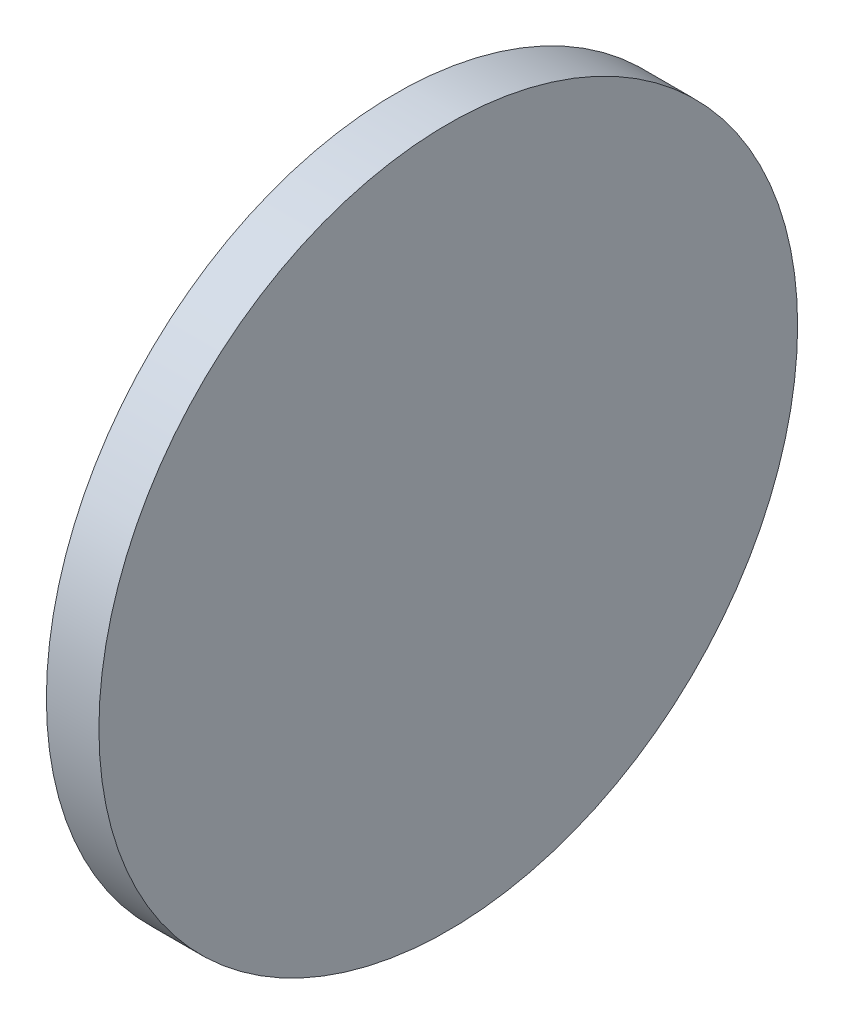
ISO-10303-21;
HEADER;
FILE_DESCRIPTION(('STEP AP214'),'2;1');
FILE_NAME('part.step','',(''),(''),'','','');
FILE_SCHEMA(('AUTOMOTIVE_DESIGN { 1 0 10303 214 1 1 1 1 }'));
ENDSEC;
DATA;
#1=APPLICATION_CONTEXT('core data for automotive mechanical design processes');
#2=APPLICATION_PROTOCOL_DEFINITION('international standard','automotive_design',2000,#1);
#3=PRODUCT_CONTEXT('',#1,'mechanical');
#4=PRODUCT('Part','Part','',(#3));
#5=PRODUCT_RELATED_PRODUCT_CATEGORY('part','',(#4));
#6=PRODUCT_DEFINITION_FORMATION('','',#4);
#7=PRODUCT_DEFINITION_CONTEXT('part definition',#1,'design');
#8=PRODUCT_DEFINITION('design','',#6,#7);
#9=PRODUCT_DEFINITION_SHAPE('','',#8);
#10=(LENGTH_UNIT() NAMED_UNIT(*) SI_UNIT(.MILLI.,.METRE.));
#11=(NAMED_UNIT(*) PLANE_ANGLE_UNIT() SI_UNIT($,.RADIAN.));
#12=(NAMED_UNIT(*) SI_UNIT($,.STERADIAN.) SOLID_ANGLE_UNIT());
#13=UNCERTAINTY_MEASURE_WITH_UNIT(LENGTH_MEASURE(1.E-05),#10,'distance_accuracy_value','');
#14=(GEOMETRIC_REPRESENTATION_CONTEXT(3) GLOBAL_UNCERTAINTY_ASSIGNED_CONTEXT((#13)) GLOBAL_UNIT_ASSIGNED_CONTEXT((#10,
#11,#12)) REPRESENTATION_CONTEXT('',''));
#15=CARTESIAN_POINT('',(0.,0.,0.));
#16=DIRECTION('',(0.,0.,1.));
#17=DIRECTION('',(1.,0.,0.));
#18=AXIS2_PLACEMENT_3D('',#15,#16,#17);
#19=CARTESIAN_POINT('',(1.5,-23.7880031249674,-50.8608241014675));
#20=DIRECTION('',(-1.,0.,0.));
#21=DIRECTION('',(0.,0.,1.));
#22=AXIS2_PLACEMENT_3D('',#19,#20,#21);
#23=CYLINDRICAL_SURFACE('',#22,9.975);
#24=CARTESIAN_POINT('',(1.5,-23.7880031249674,-50.8608241014675));
#25=DIRECTION('',(1.,0.,0.));
#26=DIRECTION('',(0.,0.,-1.));
#27=AXIS2_PLACEMENT_3D('',#24,#25,#26);
#28=CIRCLE('',#27,9.975);
#29=CARTESIAN_POINT('',(1.5,-23.7880031249674,-60.8358241014675));
#30=VERTEX_POINT('',#29);
#31=EDGE_CURVE('E10',#30,#30,#28,.T.);
#32=ORIENTED_EDGE('',*,*,#31,.F.);
#33=EDGE_LOOP('',(#32));
#34=FACE_BOUND('',#33,.T.);
#35=CARTESIAN_POINT('',(0.,-23.7880031249674,-50.8608241014675));
#36=DIRECTION('',(1.,0.,0.));
#37=DIRECTION('',(0.,0.,-1.));
#38=AXIS2_PLACEMENT_3D('',#35,#36,#37);
#39=CIRCLE('',#38,9.975);
#40=CARTESIAN_POINT('',(0.,-23.7880031249674,-60.8358241014675));
#41=VERTEX_POINT('',#40);
#42=EDGE_CURVE('E36',#41,#41,#39,.T.);
#43=ORIENTED_EDGE('',*,*,#42,.T.);
#44=EDGE_LOOP('',(#43));
#45=FACE_BOUND('',#44,.T.);
#46=ADVANCED_FACE('F33',(#34,#45),#23,.T.);
#47=CARTESIAN_POINT('',(1.5,-23.7880031249674,-50.8608241014675));
#48=DIRECTION('',(1.,0.,0.));
#49=DIRECTION('',(0.,0.,-1.));
#50=AXIS2_PLACEMENT_3D('',#47,#48,#49);
#51=PLANE('',#50);
#52=ORIENTED_EDGE('',*,*,#31,.T.);
#53=EDGE_LOOP('',(#52));
#54=FACE_BOUND('',#53,.T.);
#55=ADVANCED_FACE('F48',(#54),#51,.T.);
#56=CARTESIAN_POINT('',(0.,-23.7880031249674,-50.8608241014675));
#57=DIRECTION('',(1.,0.,0.));
#58=DIRECTION('',(0.,0.,-1.));
#59=AXIS2_PLACEMENT_3D('',#56,#57,#58);
#60=PLANE('',#59);
#61=ORIENTED_EDGE('',*,*,#42,.F.);
#62=EDGE_LOOP('',(#61));
#63=FACE_BOUND('',#62,.T.);
#64=ADVANCED_FACE('F46',(#63),#60,.F.);
#65=CLOSED_SHELL('',(#46,#55,#64));
#66=MANIFOLD_SOLID_BREP('B2',#65);
#67=ADVANCED_BREP_SHAPE_REPRESENTATION('',(#18,#66),#14);
#68=SHAPE_DEFINITION_REPRESENTATION(#9,#67);
ENDSEC;
END-ISO-10303-21;
